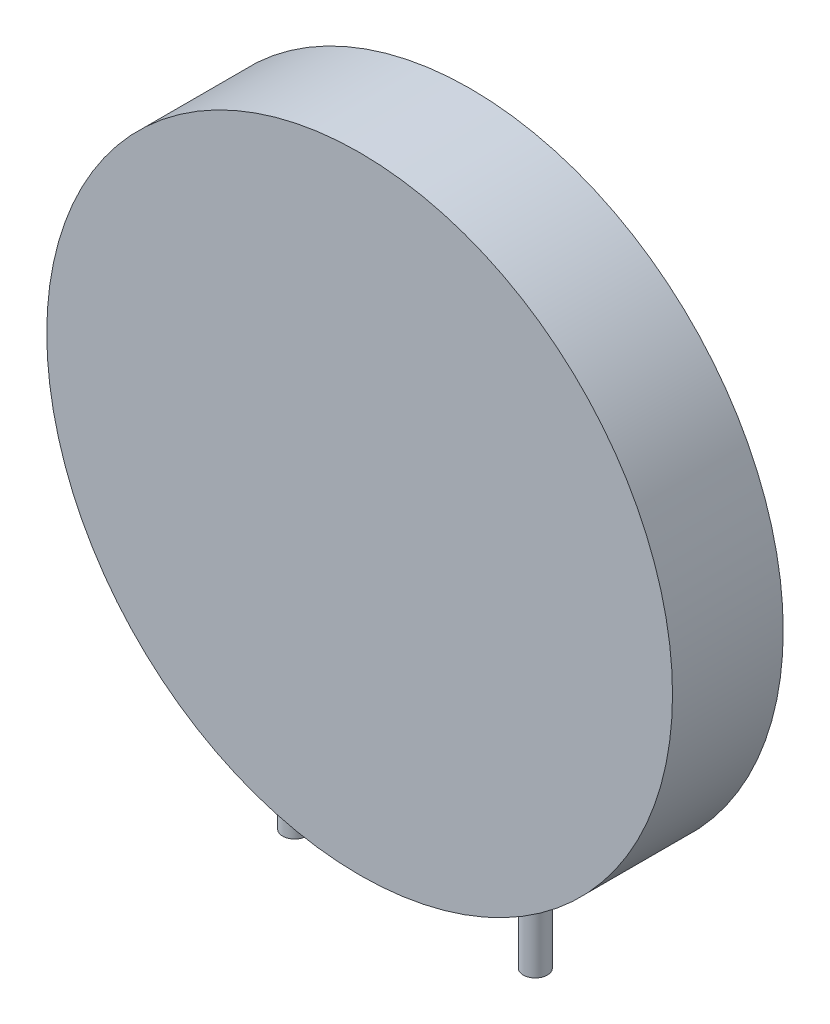
ISO-10303-21;
HEADER;
FILE_DESCRIPTION(('STEP AP214'),'2;1');
FILE_NAME('part.step','',(''),(''),'','','');
FILE_SCHEMA(('AUTOMOTIVE_DESIGN { 1 0 10303 214 1 1 1 1 }'));
ENDSEC;
DATA;
#1=APPLICATION_CONTEXT('core data for automotive mechanical design processes');
#2=APPLICATION_PROTOCOL_DEFINITION('international standard','automotive_design',2000,#1);
#3=PRODUCT_CONTEXT('',#1,'mechanical');
#4=PRODUCT('Part','Part','',(#3));
#5=PRODUCT_RELATED_PRODUCT_CATEGORY('part','',(#4));
#6=PRODUCT_DEFINITION_FORMATION('','',#4);
#7=PRODUCT_DEFINITION_CONTEXT('part definition',#1,'design');
#8=PRODUCT_DEFINITION('design','',#6,#7);
#9=PRODUCT_DEFINITION_SHAPE('','',#8);
#10=(LENGTH_UNIT() NAMED_UNIT(*) SI_UNIT(.MILLI.,.METRE.));
#11=(NAMED_UNIT(*) PLANE_ANGLE_UNIT() SI_UNIT($,.RADIAN.));
#12=(NAMED_UNIT(*) SI_UNIT($,.STERADIAN.) SOLID_ANGLE_UNIT());
#13=UNCERTAINTY_MEASURE_WITH_UNIT(LENGTH_MEASURE(1.E-05),#10,'distance_accuracy_value','');
#14=(GEOMETRIC_REPRESENTATION_CONTEXT(3) GLOBAL_UNCERTAINTY_ASSIGNED_CONTEXT((#13)) GLOBAL_UNIT_ASSIGNED_CONTEXT((#10,
#11,#12)) REPRESENTATION_CONTEXT('',''));
#15=CARTESIAN_POINT('',(0.,0.,0.));
#16=DIRECTION('',(0.,0.,1.));
#17=DIRECTION('',(1.,0.,0.));
#18=AXIS2_PLACEMENT_3D('',#15,#16,#17);
#19=CARTESIAN_POINT('',(0.,0.,2.3));
#20=DIRECTION('',(0.,0.,-1.));
#21=DIRECTION('',(-1.,0.,0.));
#22=AXIS2_PLACEMENT_3D('',#19,#20,#21);
#23=CYLINDRICAL_SURFACE('',#22,13.);
#24=CARTESIAN_POINT('',(5.,-12.,0.5));
#25=CARTESIAN_POINT('',(5.03022951537609,-11.9874041681018,0.499998936089004));
#26=CARTESIAN_POINT('',(5.06043611204852,-11.974682796932,0.497252660052013));
#27=CARTESIAN_POINT('',(5.11994833340395,-11.9493589300179,0.486343526003958));
#28=CARTESIAN_POINT('',(5.14925249428204,-11.9367566482546,0.478172307564844));
#29=CARTESIAN_POINT('',(5.20611903970637,-11.912064714509,0.456552824564593));
#30=CARTESIAN_POINT('',(5.23368003675096,-11.8999754733469,0.443100416229069));
#31=CARTESIAN_POINT('',(5.28616214277361,-11.8767551790682,0.411161902291556));
#32=CARTESIAN_POINT('',(5.31108437103738,-11.8656237200678,0.392677942897871));
#33=CARTESIAN_POINT('',(5.35657363412114,-11.8451559678069,0.351791006312445));
#34=CARTESIAN_POINT('',(5.37726406500493,-11.8357698988387,0.329550843443446));
#35=CARTESIAN_POINT('',(5.41451782117391,-11.8187739293855,0.281253091145182));
#36=CARTESIAN_POINT('',(5.43108351857235,-11.8111630081821,0.255197709585446));
#37=CARTESIAN_POINT('',(5.4580541071904,-11.7987222810318,0.202450091110704));
#38=CARTESIAN_POINT('',(5.46887064943078,-11.7937076600462,0.176012129850467));
#39=CARTESIAN_POINT('',(5.4858813993808,-11.785804793631,0.121390841360312));
#40=CARTESIAN_POINT('',(5.49207870020349,-11.7829151253188,0.0932086957817878));
#41=CARTESIAN_POINT('',(5.49920949541569,-11.7795886464467,0.0385247766270675));
#42=CARTESIAN_POINT('',(5.50054976539694,-11.7789622977607,0.0120868684865885));
#43=CARTESIAN_POINT('',(5.49904252074086,-11.7796660481978,-0.0406396568015651));
#44=CARTESIAN_POINT('',(5.49619597412546,-11.7809956950807,-0.0669283070481187));
#45=CARTESIAN_POINT('',(5.48660549344102,-11.785465049119,-0.117738827854406));
#46=CARTESIAN_POINT('',(5.47998925132017,-11.7885454445955,-0.142290317034537));
#47=CARTESIAN_POINT('',(5.46322935066224,-11.7963218781251,-0.189882332244819));
#48=CARTESIAN_POINT('',(5.45308530874089,-11.8010180917767,-0.212922693729295));
#49=CARTESIAN_POINT('',(5.42922169170016,-11.812016327904,-0.257752513589412));
#50=CARTESIAN_POINT('',(5.41538774906635,-11.8183695362757,-0.279468305550968));
#51=CARTESIAN_POINT('',(5.38480293665899,-11.8323361857952,-0.320277362915382));
#52=CARTESIAN_POINT('',(5.36805116543098,-11.8399500163724,-0.339369814574567));
#53=CARTESIAN_POINT('',(5.33067675838476,-11.8568266238978,-0.376020507325062));
#54=CARTESIAN_POINT('',(5.30985166462628,-11.8661725880795,-0.393333819460588));
#55=CARTESIAN_POINT('',(5.26596502267016,-11.8857136822138,-0.424245010480985));
#56=CARTESIAN_POINT('',(5.24290261687312,-11.8959091375777,-0.437841456943457));
#57=CARTESIAN_POINT('',(5.19305018753087,-11.9177611779393,-0.462130966243828));
#58=CARTESIAN_POINT('',(5.16611024813961,-11.9294679071108,-0.472471876423239));
#59=CARTESIAN_POINT('',(5.11098178056258,-11.9531906432693,-0.488371507278049));
#60=CARTESIAN_POINT('',(5.08279284441599,-11.9652067507639,-0.493928653139329));
#61=CARTESIAN_POINT('',(5.02430654492903,-11.9898875855544,-0.500320885981574));
#62=CARTESIAN_POINT('',(4.99397835494189,-12.0025517297066,-0.500880175910969));
#63=CARTESIAN_POINT('',(4.93356287931314,-12.0275112132456,-0.49649123298801));
#64=CARTESIAN_POINT('',(4.90347561965241,-12.0398065132403,-0.491542414010812));
#65=CARTESIAN_POINT('',(4.84440331334026,-12.0636964750968,-0.476153286110458));
#66=CARTESIAN_POINT('',(4.81541936456633,-12.0752904455076,-0.465707653106284));
#67=CARTESIAN_POINT('',(4.75953899627002,-12.0974250078359,-0.439466145306574));
#68=CARTESIAN_POINT('',(4.7326420794055,-12.1079658508882,-0.423671550017525));
#69=CARTESIAN_POINT('',(4.68315823209527,-12.127188492572,-0.387939802887669));
#70=CARTESIAN_POINT('',(4.6604258804327,-12.1359354906639,-0.368239571731322));
#71=CARTESIAN_POINT('',(4.61862719569813,-12.1519045534991,-0.324750712499561));
#72=CARTESIAN_POINT('',(4.59955918681581,-12.1591273154688,-0.300963962779747));
#73=CARTESIAN_POINT('',(4.5670884039613,-12.1713591845704,-0.251782174341569));
#74=CARTESIAN_POINT('',(4.55338174645619,-12.1764881572152,-0.226617511325577));
#75=CARTESIAN_POINT('',(4.5304045454348,-12.1850558538933,-0.174072445954445));
#76=CARTESIAN_POINT('',(4.52113218389047,-12.1884952706476,-0.146692957053568));
#77=CARTESIAN_POINT('',(4.50784010953921,-12.1934172772489,-0.0922801460194977));
#78=CARTESIAN_POINT('',(4.50353802511799,-12.195005116055,-0.0653250419035362));
#79=CARTESIAN_POINT('',(4.49938126413666,-12.1965394080986,-0.0110297644758472));
#80=CARTESIAN_POINT('',(4.49952563307394,-12.19648621361,0.0163103249330564));
#81=CARTESIAN_POINT('',(4.50418472626444,-12.1947663126841,0.0697568536482296));
#82=CARTESIAN_POINT('',(4.50857222515286,-12.1931465770855,0.0958760463645291));
#83=CARTESIAN_POINT('',(4.52136229934697,-12.1884096178093,0.146967469594753));
#84=CARTESIAN_POINT('',(4.5297648526478,-12.1852924023387,0.171939706393849));
#85=CARTESIAN_POINT('',(4.55036109606797,-12.177616142232,0.220274237640932));
#86=CARTESIAN_POINT('',(4.56258544478349,-12.1730454323277,0.243621576064474));
#87=CARTESIAN_POINT('',(4.59037350497579,-12.1625939154472,0.287905901380838));
#88=CARTESIAN_POINT('',(4.60593756792996,-12.156712970577,0.30884263422066));
#89=CARTESIAN_POINT('',(4.640603865965,-12.1435230775453,0.348653610978416));
#90=CARTESIAN_POINT('',(4.65982511292851,-12.1361654211155,0.367407914273766));
#91=CARTESIAN_POINT('',(4.70074697107854,-12.1203737025887,0.401443138141618));
#92=CARTESIAN_POINT('',(4.72244884496035,-12.1119390920397,0.416722277840341));
#93=CARTESIAN_POINT('',(4.76914182958632,-12.0936327609747,0.444394856135106));
#94=CARTESIAN_POINT('',(4.79425403772733,-12.0837039726075,0.456545764035742));
#95=CARTESIAN_POINT('',(4.84585079059121,-12.0631049035572,0.476446983178637));
#96=CARTESIAN_POINT('',(4.8723341418412,-12.0524352650554,0.484201053518003));
#97=CARTESIAN_POINT('',(4.9157966483021,-12.0347524996141,0.493151986542703));
#98=CARTESIAN_POINT('',(4.93256733470672,-12.0278888619368,0.495720640598984));
#99=CARTESIAN_POINT('',(4.96622772885439,-12.014029869513,0.499144958788646));
#100=CARTESIAN_POINT('',(4.98311743859024,-12.0070345125578,0.500000594172368));
#101=CARTESIAN_POINT('',(5.,-12.,0.5));
#102=B_SPLINE_CURVE_WITH_KNOTS('',3,(#24,#25,#26,#27,#28,#29,#30,#31,#32,#33,#34,#35,#36,#37,
#38,#39,#40,#41,#42,#43,#44,#45,#46,#47,#48,#49,#50,#51,#52,#53,#54,#55,#56,#57,#58,#59,#60,#61,
#62,#63,#64,#65,#66,#67,#68,#69,#70,#71,#72,#73,#74,#75,#76,#77,#78,#79,#80,#81,#82,#83,#84,#85,
#86,#87,#88,#89,#90,#91,#92,#93,#94,#95,#96,#97,#98,#99,#100,#101),.UNSPECIFIED.,.T.,.F.,(4,2,2,
2,2,2,2,2,2,2,2,2,2,2,2,2,2,2,2,2,2,2,2,2,2,2,2,2,2,2,2,2,2,2,2,2,2,2,4),(0.,0.0981802935852407,
0.196512246029583,0.294921507268647,0.393288857632193,0.488156745836578,0.582969949330248,
0.669504085273225,0.75598022448168,0.83502099208319,0.914043487766643,0.99053608809474,
1.06703700386909,1.14625960120317,1.2255067176769,1.31109361071691,1.39671344126781,
1.48972762009305,1.58277240746765,1.68092198100507,1.77908199976152,1.87733726940744,
1.97556905233711,2.0690564455196,2.1625009819221,2.2493809584044,2.33622528414596,
2.417846502928,2.49945020052711,2.57868061385862,2.65791059296577,2.73779321327204,
2.81768424469253,2.90085469544503,2.9840676719705,3.07252459878306,3.1609057844565,
3.21573653504207,3.27056820584655),.UNSPECIFIED.);
#103=CARTESIAN_POINT('',(5.,-12.,0.5));
#104=VERTEX_POINT('',#103);
#105=EDGE_CURVE('E37',#104,#104,#102,.T.);
#106=ORIENTED_EDGE('',*,*,#105,.T.);
#107=EDGE_LOOP('',(#106));
#108=FACE_BOUND('',#107,.T.);
#109=CARTESIAN_POINT('',(-5.,-12.,0.5));
#110=CARTESIAN_POINT('',(-4.9704076997093,-12.0123299470856,0.499998990574843));
#111=CARTESIAN_POINT('',(-4.94074826001519,-12.0245584509131,0.497367660220496));
#112=CARTESIAN_POINT('',(-4.88212575593853,-12.048479289932,0.486820527236215));
#113=CARTESIAN_POINT('',(-4.85316353904558,-12.060170986872,0.478898599645892));
#114=CARTESIAN_POINT('',(-4.79677448245732,-12.0827098723601,0.457827941171893));
#115=CARTESIAN_POINT('',(-4.76935050054677,-12.093555502767,0.444669826858983));
#116=CARTESIAN_POINT('',(-4.71703301736927,-12.1140575094752,0.413350050539678));
#117=CARTESIAN_POINT('',(-4.69213833410112,-12.1237144417337,0.395190740570541));
#118=CARTESIAN_POINT('',(-4.64693769999935,-12.1411090707844,0.35526359159998));
#119=CARTESIAN_POINT('',(-4.62646865851949,-12.1489167265275,0.333711261246071));
#120=CARTESIAN_POINT('',(-4.58948569442758,-12.1629360487298,0.286991907948723));
#121=CARTESIAN_POINT('',(-4.57297013447634,-12.1691483759739,0.261826388344241));
#122=CARTESIAN_POINT('',(-4.54560786308949,-12.1793944195697,0.2105078565358));
#123=CARTESIAN_POINT('',(-4.53444497780713,-12.1835503077345,0.184547657386116));
#124=CARTESIAN_POINT('',(-4.51661966802735,-12.1901697361769,0.130922934320194));
#125=CARTESIAN_POINT('',(-4.50995558271156,-12.1926339009923,0.103259043474614));
#126=CARTESIAN_POINT('',(-4.50164165012607,-12.1957058411808,0.04860340492853));
#127=CARTESIAN_POINT('',(-4.49974372504878,-12.1964054694312,0.0216542903696544));
#128=CARTESIAN_POINT('',(-4.50031177064403,-12.1961958899344,-0.0321893940414575));
#129=CARTESIAN_POINT('',(-4.50277704605482,-12.1952869385091,-0.05908397190028));
#130=CARTESIAN_POINT('',(-4.51188273328535,-12.1919209602109,-0.111517627152165));
#131=CARTESIAN_POINT('',(-4.51844203921309,-12.1894940042433,-0.137072818341052));
#132=CARTESIAN_POINT('',(-4.53541504399695,-12.183188899331,-0.186676438057038));
#133=CARTESIAN_POINT('',(-4.54582889037993,-12.179310694842,-0.210724808871613));
#134=CARTESIAN_POINT('',(-4.57035819349179,-12.1701273495252,-0.257115916501165));
#135=CARTESIAN_POINT('',(-4.58453611883382,-12.1647980846387,-0.279420766200426));
#136=CARTESIAN_POINT('',(-4.61601956014821,-12.1528863281163,-0.321319425353745));
#137=CARTESIAN_POINT('',(-4.6333256541039,-12.1463036048703,-0.340912732620153));
#138=CARTESIAN_POINT('',(-4.67142871497999,-12.1317018107093,-0.377860573324138));
#139=CARTESIAN_POINT('',(-4.69235384805825,-12.1236287516804,-0.395061423379544));
#140=CARTESIAN_POINT('',(-4.73641257505968,-12.1064839954457,-0.425726125854472));
#141=CARTESIAN_POINT('',(-4.75954678316402,-12.0974120204069,-0.439188934910599));
#142=CARTESIAN_POINT('',(-4.80895955694316,-12.0778581765572,-0.462928689859983));
#143=CARTESIAN_POINT('',(-4.83534481883344,-12.0673228955139,-0.472939532008032));
#144=CARTESIAN_POINT('',(-4.88917380195255,-12.0456142460796,-0.488366876018125));
#145=CARTESIAN_POINT('',(-4.91661785191943,-12.0344406789842,-0.493781938759557));
#146=CARTESIAN_POINT('',(-4.97359903090793,-12.0110082322836,-0.500175126271838));
#147=CARTESIAN_POINT('',(-5.00315986885237,-11.9987251453451,-0.500855152819876));
#148=CARTESIAN_POINT('',(-5.06190632676872,-11.974060309797,-0.497025797214777));
#149=CARTESIAN_POINT('',(-5.09109184485396,-11.9616785358156,-0.492515034802316));
#150=CARTESIAN_POINT('',(-5.14927196116246,-11.9367513322664,-0.478168325880149));
#151=CARTESIAN_POINT('',(-5.17822794922557,-11.9242141486324,-0.468160314159107));
#152=CARTESIAN_POINT('',(-5.23406704906536,-11.8998097110901,-0.442890087506459));
#153=CARTESIAN_POINT('',(-5.26095007349264,-11.8879424854177,-0.427627651314755));
#154=CARTESIAN_POINT('',(-5.31124507352113,-11.8655559947672,-0.392490087273195));
#155=CARTESIAN_POINT('',(-5.33471604432971,-11.8550143981482,-0.372714033504449));
#156=CARTESIAN_POINT('',(-5.37793680227994,-11.8354703792359,-0.328802838335749));
#157=CARTESIAN_POINT('',(-5.3976883882715,-11.8264672130895,-0.304669815267789));
#158=CARTESIAN_POINT('',(-5.43126701374121,-11.8110818719836,-0.254649855524692));
#159=CARTESIAN_POINT('',(-5.44542908338417,-11.804552997048,-0.229033483857958));
#160=CARTESIAN_POINT('',(-5.46916221630318,-11.7935760975064,-0.175345987769329));
#161=CARTESIAN_POINT('',(-5.47873668351978,-11.7891265301423,-0.147276701719855));
#162=CARTESIAN_POINT('',(-5.49213924055838,-11.7828882746821,-0.0923217908041916));
#163=CARTESIAN_POINT('',(-5.49641979562696,-11.7808902107528,-0.0655697357868413));
#164=CARTESIAN_POINT('',(-5.50059392243821,-11.7789419043106,-0.0116549144115071));
#165=CARTESIAN_POINT('',(-5.50048913883456,-11.7789908940817,0.0155076941542664));
#166=CARTESIAN_POINT('',(-5.49602525252683,-11.781074287268,0.0679254924278035));
#167=CARTESIAN_POINT('',(-5.49189447584153,-11.7830021348109,0.0932048842346249));
#168=CARTESIAN_POINT('',(-5.47989235598705,-11.7885886837715,0.142655993171533));
#169=CARTESIAN_POINT('',(-5.47202094146572,-11.7922474182057,0.16682768916283));
#170=CARTESIAN_POINT('',(-5.45270858042094,-11.8011899082047,0.21379739314249));
#171=CARTESIAN_POINT('',(-5.44121712568984,-11.8064966414175,0.236570148680391));
#172=CARTESIAN_POINT('',(-5.41511912119611,-11.8184893542396,0.279848511399358));
#173=CARTESIAN_POINT('',(-5.40051190729644,-11.8251756278936,0.300353633807791));
#174=CARTESIAN_POINT('',(-5.36753291087645,-11.8401832779505,0.340044771868615));
#175=CARTESIAN_POINT('',(-5.34897070443802,-11.8485857301091,0.359041636626634));
#176=CARTESIAN_POINT('',(-5.30935986277177,-11.8663882213844,0.393687308681771));
#177=CARTESIAN_POINT('',(-5.28830970617697,-11.8757888705322,0.409334050786788));
#178=CARTESIAN_POINT('',(-5.24230664787831,-11.8961720009634,0.438281231736577));
#179=CARTESIAN_POINT('',(-5.21717310655921,-11.9072207819682,0.451247770504338));
#180=CARTESIAN_POINT('',(-5.16530170514144,-11.9298137816436,0.472718148337746));
#181=CARTESIAN_POINT('',(-5.13856508104483,-11.9413576167128,0.481225377523715));
#182=CARTESIAN_POINT('',(-5.09309930862913,-11.9607999577971,0.491613452732799));
#183=CARTESIAN_POINT('',(-5.07462673982918,-11.9686494806724,0.494753229099752));
#184=CARTESIAN_POINT('',(-5.03744509374764,-11.9843462240953,0.498946878643832));
#185=CARTESIAN_POINT('',(-5.01873600374083,-11.9921934444957,0.500000639105217));
#186=CARTESIAN_POINT('',(-5.,-12.,0.5));
#187=B_SPLINE_CURVE_WITH_KNOTS('',3,(#109,#110,#111,#112,#113,#114,#115,#116,#117,#118,#119,
#120,#121,#122,#123,#124,#125,#126,#127,#128,#129,#130,#131,#132,#133,#134,#135,#136,#137,#138,
#139,#140,#141,#142,#143,#144,#145,#146,#147,#148,#149,#150,#151,#152,#153,#154,#155,#156,#157,
#158,#159,#160,#161,#162,#163,#164,#165,#166,#167,#168,#169,#170,#171,#172,#173,#174,#175,#176,
#177,#178,#179,#180,#181,#182,#183,#184,#185,#186),.UNSPECIFIED.,.T.,.F.,(4,2,2,2,2,2,2,2,2,2,2,
2,2,2,2,2,2,2,2,2,2,2,2,2,2,2,2,2,2,2,2,2,2,2,2,2,2,2,4),(0.,0.0961039636076975,
0.192319380744041,0.288708001370442,0.385051368093449,0.476761971053472,0.56843452598721,
0.653682332996264,0.73889865190609,0.819577873694483,0.900244240669826,0.979361162112831,
1.05848111195244,1.13900653426425,1.21954685027961,1.30397417463011,1.38842504073128,
1.47840182212055,1.56840676842013,1.66403063465283,1.75967993367387,1.85850937716886,
1.95734298281093,2.05418638728935,2.15098283327469,2.24046074730121,2.32987216668788,
2.41094888460986,2.49199519623121,2.568697549509,2.64540136593247,2.72322668679973,
2.80106861306495,2.88429115106966,2.96756484505759,3.05826840556594,3.14890290973495,
3.20974667375717,3.27059372532038),.UNSPECIFIED.);
#188=CARTESIAN_POINT('',(-5.,-12.,0.5));
#189=VERTEX_POINT('',#188);
#190=EDGE_CURVE('E49',#189,#189,#187,.T.);
#191=ORIENTED_EDGE('',*,*,#190,.T.);
#192=EDGE_LOOP('',(#191));
#193=FACE_BOUND('',#192,.T.);
#194=CARTESIAN_POINT('',(0.,0.,2.3));
#195=DIRECTION('',(0.,0.,1.));
#196=DIRECTION('',(1.,0.,0.));
#197=AXIS2_PLACEMENT_3D('',#194,#195,#196);
#198=CIRCLE('',#197,13.);
#199=CARTESIAN_POINT('',(13.,0.,2.3));
#200=VERTEX_POINT('',#199);
#201=EDGE_CURVE('E10',#200,#200,#198,.T.);
#202=ORIENTED_EDGE('',*,*,#201,.F.);
#203=EDGE_LOOP('',(#202));
#204=FACE_BOUND('',#203,.T.);
#205=CARTESIAN_POINT('',(0.,0.,-2.3));
#206=DIRECTION('',(0.,0.,1.));
#207=DIRECTION('',(1.,0.,0.));
#208=AXIS2_PLACEMENT_3D('',#205,#206,#207);
#209=CIRCLE('',#208,13.);
#210=CARTESIAN_POINT('',(13.,0.,-2.3));
#211=VERTEX_POINT('',#210);
#212=EDGE_CURVE('E44',#211,#211,#209,.T.);
#213=ORIENTED_EDGE('',*,*,#212,.T.);
#214=EDGE_LOOP('',(#213));
#215=FACE_BOUND('',#214,.T.);
#216=ADVANCED_FACE('F33',(#108,#193,#204,#215),#23,.T.);
#217=CARTESIAN_POINT('',(0.,0.,2.3));
#218=DIRECTION('',(0.,0.,1.));
#219=DIRECTION('',(1.,0.,0.));
#220=AXIS2_PLACEMENT_3D('',#217,#218,#219);
#221=PLANE('',#220);
#222=ORIENTED_EDGE('',*,*,#201,.T.);
#223=EDGE_LOOP('',(#222));
#224=FACE_BOUND('',#223,.T.);
#225=ADVANCED_FACE('F66',(#224),#221,.T.);
#226=CARTESIAN_POINT('',(0.,0.,-2.3));
#227=DIRECTION('',(0.,0.,1.));
#228=DIRECTION('',(1.,0.,0.));
#229=AXIS2_PLACEMENT_3D('',#226,#227,#228);
#230=PLANE('',#229);
#231=ORIENTED_EDGE('',*,*,#212,.F.);
#232=EDGE_LOOP('',(#231));
#233=FACE_BOUND('',#232,.T.);
#234=ADVANCED_FACE('F64',(#233),#230,.F.);
#235=CARTESIAN_POINT('',(-5.,-15.,0.));
#236=DIRECTION('',(0.,1.,0.));
#237=DIRECTION('',(0.,0.,1.));
#238=AXIS2_PLACEMENT_3D('',#235,#236,#237);
#239=CYLINDRICAL_SURFACE('',#238,0.5);
#240=CARTESIAN_POINT('',(-5.,-15.,0.));
#241=DIRECTION('',(0.,1.,0.));
#242=DIRECTION('',(0.,0.,1.));
#243=AXIS2_PLACEMENT_3D('',#240,#241,#242);
#244=CIRCLE('',#243,0.5);
#245=CARTESIAN_POINT('',(-5.,-15.,0.5));
#246=VERTEX_POINT('',#245);
#247=EDGE_CURVE('E52',#246,#246,#244,.T.);
#248=ORIENTED_EDGE('',*,*,#247,.T.);
#249=EDGE_LOOP('',(#248));
#250=FACE_BOUND('',#249,.T.);
#251=ORIENTED_EDGE('',*,*,#190,.F.);
#252=EDGE_LOOP('',(#251));
#253=FACE_BOUND('',#252,.T.);
#254=ADVANCED_FACE('F58',(#250,#253),#239,.T.);
#255=CARTESIAN_POINT('',(-5.,-15.,0.));
#256=DIRECTION('',(0.,1.,0.));
#257=DIRECTION('',(0.,0.,1.));
#258=AXIS2_PLACEMENT_3D('',#255,#256,#257);
#259=PLANE('',#258);
#260=ORIENTED_EDGE('',*,*,#247,.F.);
#261=EDGE_LOOP('',(#260));
#262=FACE_BOUND('',#261,.T.);
#263=ADVANCED_FACE('F63',(#262),#259,.F.);
#264=CARTESIAN_POINT('',(5.,-15.,0.));
#265=DIRECTION('',(0.,1.,0.));
#266=DIRECTION('',(0.,0.,1.));
#267=AXIS2_PLACEMENT_3D('',#264,#265,#266);
#268=CYLINDRICAL_SURFACE('',#267,0.5);
#269=CARTESIAN_POINT('',(5.,-15.,0.));
#270=DIRECTION('',(0.,1.,0.));
#271=DIRECTION('',(0.,0.,1.));
#272=AXIS2_PLACEMENT_3D('',#269,#270,#271);
#273=CIRCLE('',#272,0.5);
#274=CARTESIAN_POINT('',(5.,-15.,0.5));
#275=VERTEX_POINT('',#274);
#276=EDGE_CURVE('E85',#275,#275,#273,.T.);
#277=ORIENTED_EDGE('',*,*,#276,.T.);
#278=EDGE_LOOP('',(#277));
#279=FACE_BOUND('',#278,.T.);
#280=ORIENTED_EDGE('',*,*,#105,.F.);
#281=EDGE_LOOP('',(#280));
#282=FACE_BOUND('',#281,.T.);
#283=ADVANCED_FACE('F90',(#279,#282),#268,.T.);
#284=CARTESIAN_POINT('',(5.,-15.,0.));
#285=DIRECTION('',(0.,1.,0.));
#286=DIRECTION('',(0.,0.,1.));
#287=AXIS2_PLACEMENT_3D('',#284,#285,#286);
#288=PLANE('',#287);
#289=ORIENTED_EDGE('',*,*,#276,.F.);
#290=EDGE_LOOP('',(#289));
#291=FACE_BOUND('',#290,.T.);
#292=ADVANCED_FACE('F92',(#291),#288,.F.);
#293=CLOSED_SHELL('',(#216,#225,#234,#254,#263,#283,#292));
#294=MANIFOLD_SOLID_BREP('B2',#293);
#295=ADVANCED_BREP_SHAPE_REPRESENTATION('',(#18,#294),#14);
#296=SHAPE_DEFINITION_REPRESENTATION(#9,#295);
ENDSEC;
END-ISO-10303-21;
